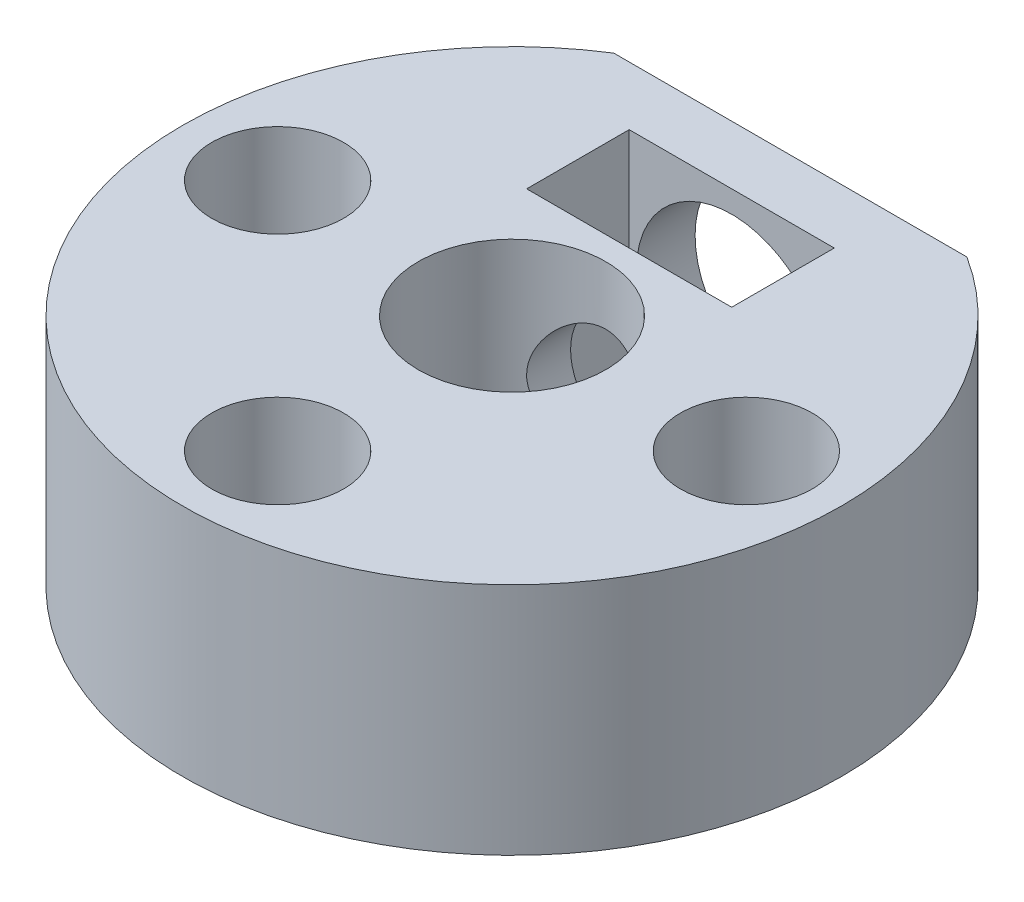
ISO-10303-21;
HEADER;
FILE_DESCRIPTION(('STEP AP214'),'2;1');
FILE_NAME('part.step','',(''),(''),'','','');
FILE_SCHEMA(('AUTOMOTIVE_DESIGN { 1 0 10303 214 1 1 1 1 }'));
ENDSEC;
DATA;
#1=APPLICATION_CONTEXT('core data for automotive mechanical design processes');
#2=APPLICATION_PROTOCOL_DEFINITION('international standard','automotive_design',2000,#1);
#3=PRODUCT_CONTEXT('',#1,'mechanical');
#4=PRODUCT('Part','Part','',(#3));
#5=PRODUCT_RELATED_PRODUCT_CATEGORY('part','',(#4));
#6=PRODUCT_DEFINITION_FORMATION('','',#4);
#7=PRODUCT_DEFINITION_CONTEXT('part definition',#1,'design');
#8=PRODUCT_DEFINITION('design','',#6,#7);
#9=PRODUCT_DEFINITION_SHAPE('','',#8);
#10=(LENGTH_UNIT() NAMED_UNIT(*) SI_UNIT(.MILLI.,.METRE.));
#11=(NAMED_UNIT(*) PLANE_ANGLE_UNIT() SI_UNIT($,.RADIAN.));
#12=(NAMED_UNIT(*) SI_UNIT($,.STERADIAN.) SOLID_ANGLE_UNIT());
#13=UNCERTAINTY_MEASURE_WITH_UNIT(LENGTH_MEASURE(1.E-05),#10,'distance_accuracy_value','');
#14=(GEOMETRIC_REPRESENTATION_CONTEXT(3) GLOBAL_UNCERTAINTY_ASSIGNED_CONTEXT((#13)) GLOBAL_UNIT_ASSIGNED_CONTEXT((#10,
#11,#12)) REPRESENTATION_CONTEXT('',''));
#15=CARTESIAN_POINT('',(0.,0.,0.));
#16=DIRECTION('',(0.,0.,1.));
#17=DIRECTION('',(1.,0.,0.));
#18=AXIS2_PLACEMENT_3D('',#15,#16,#17);
#19=CARTESIAN_POINT('',(0.,8.,0.));
#20=DIRECTION('',(0.,-1.,0.));
#21=DIRECTION('',(0.,0.,-1.));
#22=AXIS2_PLACEMENT_3D('',#19,#20,#21);
#23=CYLINDRICAL_SURFACE('',#22,11.25);
#24=CARTESIAN_POINT('',(0.,0.,0.));
#25=DIRECTION('',(0.,1.,0.));
#26=DIRECTION('',(0.,0.,1.));
#27=AXIS2_PLACEMENT_3D('',#24,#25,#26);
#28=CIRCLE('',#27,11.25);
#29=CARTESIAN_POINT('',(-6.02598539659698,0.,-9.5));
#30=VERTEX_POINT('',#29);
#31=CARTESIAN_POINT('',(6.02598539659698,0.,-9.5));
#32=VERTEX_POINT('',#31);
#33=EDGE_CURVE('E154',#30,#32,#28,.T.);
#34=ORIENTED_EDGE('',*,*,#33,.T.);
#35=DIRECTION('',(0.,-1.,0.));
#36=VECTOR('',#35,1.);
#37=CARTESIAN_POINT('',(6.02598539659698,8.,-9.5));
#38=LINE('',#37,#36);
#39=CARTESIAN_POINT('',(6.02598539659698,8.,-9.5));
#40=VERTEX_POINT('',#39);
#41=EDGE_CURVE('E11',#40,#32,#38,.T.);
#42=ORIENTED_EDGE('',*,*,#41,.F.);
#43=CARTESIAN_POINT('',(0.,8.,0.));
#44=DIRECTION('',(0.,1.,0.));
#45=DIRECTION('',(0.,0.,1.));
#46=AXIS2_PLACEMENT_3D('',#43,#44,#45);
#47=CIRCLE('',#46,11.25);
#48=CARTESIAN_POINT('',(-6.02598539659698,8.,-9.5));
#49=VERTEX_POINT('',#48);
#50=EDGE_CURVE('E158',#49,#40,#47,.T.);
#51=ORIENTED_EDGE('',*,*,#50,.F.);
#52=DIRECTION('',(0.,-1.,0.));
#53=VECTOR('',#52,1.);
#54=CARTESIAN_POINT('',(-6.02598539659698,8.,-9.5));
#55=LINE('',#54,#53);
#56=EDGE_CURVE('E53',#49,#30,#55,.T.);
#57=ORIENTED_EDGE('',*,*,#56,.T.);
#58=EDGE_LOOP('',(#34,#42,#51,#57));
#59=FACE_BOUND('',#58,.T.);
#60=ADVANCED_FACE('F39',(#59),#23,.T.);
#61=CARTESIAN_POINT('',(6.02598539659698,8.,-9.5));
#62=DIRECTION('',(0.,0.,1.));
#63=DIRECTION('',(1.,0.,0.));
#64=AXIS2_PLACEMENT_3D('',#61,#62,#63);
#65=PLANE('',#64);
#66=CARTESIAN_POINT('',(0.,4.,-9.5));
#67=DIRECTION('',(0.,0.,-1.));
#68=DIRECTION('',(-1.,0.,0.));
#69=AXIS2_PLACEMENT_3D('',#66,#67,#68);
#70=CIRCLE('',#69,3.25);
#71=CARTESIAN_POINT('',(-3.25,4.,-9.5));
#72=VERTEX_POINT('',#71);
#73=EDGE_CURVE('E434',#72,#72,#70,.T.);
#74=ORIENTED_EDGE('',*,*,#73,.F.);
#75=EDGE_LOOP('',(#74));
#76=FACE_BOUND('',#75,.T.);
#77=DIRECTION('',(-1.,0.,0.));
#78=VECTOR('',#77,1.);
#79=CARTESIAN_POINT('',(6.02598539659698,0.,-9.5));
#80=LINE('',#79,#78);
#81=EDGE_CURVE('E163',#32,#30,#80,.T.);
#82=ORIENTED_EDGE('',*,*,#81,.T.);
#83=ORIENTED_EDGE('',*,*,#56,.F.);
#84=DIRECTION('',(-1.,0.,0.));
#85=VECTOR('',#84,1.);
#86=CARTESIAN_POINT('',(6.02598539659698,8.,-9.5));
#87=LINE('',#86,#85);
#88=EDGE_CURVE('E162',#40,#49,#87,.T.);
#89=ORIENTED_EDGE('',*,*,#88,.F.);
#90=ORIENTED_EDGE('',*,*,#41,.T.);
#91=EDGE_LOOP('',(#82,#83,#89,#90));
#92=FACE_BOUND('',#91,.T.);
#93=ADVANCED_FACE('F180',(#76,#92),#65,.F.);
#94=CARTESIAN_POINT('',(0.,8.,0.));
#95=DIRECTION('',(0.,1.,0.));
#96=DIRECTION('',(0.,0.,1.));
#97=AXIS2_PLACEMENT_3D('',#94,#95,#96);
#98=PLANE('',#97);
#99=CARTESIAN_POINT('',(-8.,8.,0.));
#100=DIRECTION('',(0.,1.,0.));
#101=DIRECTION('',(0.,0.,1.));
#102=AXIS2_PLACEMENT_3D('',#99,#100,#101);
#103=CIRCLE('',#102,2.25);
#104=CARTESIAN_POINT('',(-8.,8.,2.25));
#105=VERTEX_POINT('',#104);
#106=EDGE_CURVE('E426',#105,#105,#103,.T.);
#107=ORIENTED_EDGE('',*,*,#106,.F.);
#108=EDGE_LOOP('',(#107));
#109=FACE_BOUND('',#108,.T.);
#110=CARTESIAN_POINT('',(0.,8.,8.));
#111=DIRECTION('',(0.,1.,0.));
#112=DIRECTION('',(0.,0.,1.));
#113=AXIS2_PLACEMENT_3D('',#110,#111,#112);
#114=CIRCLE('',#113,2.25);
#115=CARTESIAN_POINT('',(0.,8.,10.25));
#116=VERTEX_POINT('',#115);
#117=EDGE_CURVE('E410',#116,#116,#114,.T.);
#118=ORIENTED_EDGE('',*,*,#117,.F.);
#119=EDGE_LOOP('',(#118));
#120=FACE_BOUND('',#119,.T.);
#121=CARTESIAN_POINT('',(8.,8.,0.));
#122=DIRECTION('',(0.,1.,0.));
#123=DIRECTION('',(0.,0.,1.));
#124=AXIS2_PLACEMENT_3D('',#121,#122,#123);
#125=CIRCLE('',#124,2.25);
#126=CARTESIAN_POINT('',(8.,8.,2.25));
#127=VERTEX_POINT('',#126);
#128=EDGE_CURVE('E392',#127,#127,#125,.T.);
#129=ORIENTED_EDGE('',*,*,#128,.F.);
#130=EDGE_LOOP('',(#129));
#131=FACE_BOUND('',#130,.T.);
#132=DIRECTION('',(0.,0.,-1.));
#133=VECTOR('',#132,1.);
#134=CARTESIAN_POINT('',(3.5,8.,-4.));
#135=LINE('',#134,#133);
#136=CARTESIAN_POINT('',(3.5,8.,-4.));
#137=VERTEX_POINT('',#136);
#138=CARTESIAN_POINT('',(3.5,8.,-7.5));
#139=VERTEX_POINT('',#138);
#140=EDGE_CURVE('E60',#137,#139,#135,.T.);
#141=ORIENTED_EDGE('',*,*,#140,.F.);
#142=DIRECTION('',(1.,0.,0.));
#143=VECTOR('',#142,1.);
#144=CARTESIAN_POINT('',(-3.5,8.,-4.));
#145=LINE('',#144,#143);
#146=CARTESIAN_POINT('',(-3.5,8.,-4.));
#147=VERTEX_POINT('',#146);
#148=EDGE_CURVE('E119',#147,#137,#145,.T.);
#149=ORIENTED_EDGE('',*,*,#148,.F.);
#150=DIRECTION('',(0.,0.,1.));
#151=VECTOR('',#150,1.);
#152=CARTESIAN_POINT('',(-3.5,8.,-4.));
#153=LINE('',#152,#151);
#154=CARTESIAN_POINT('',(-3.5,8.,-7.5));
#155=VERTEX_POINT('',#154);
#156=EDGE_CURVE('E123',#155,#147,#153,.T.);
#157=ORIENTED_EDGE('',*,*,#156,.F.);
#158=DIRECTION('',(-1.,0.,0.));
#159=VECTOR('',#158,1.);
#160=CARTESIAN_POINT('',(-3.5,8.,-7.5));
#161=LINE('',#160,#159);
#162=EDGE_CURVE('E135',#139,#155,#161,.T.);
#163=ORIENTED_EDGE('',*,*,#162,.F.);
#164=EDGE_LOOP('',(#141,#149,#157,#163));
#165=FACE_BOUND('',#164,.T.);
#166=CARTESIAN_POINT('',(0.,8.,0.));
#167=DIRECTION('',(0.,1.,0.));
#168=DIRECTION('',(0.,0.,1.));
#169=AXIS2_PLACEMENT_3D('',#166,#167,#168);
#170=CIRCLE('',#169,3.2);
#171=CARTESIAN_POINT('',(0.,8.,3.2));
#172=VERTEX_POINT('',#171);
#173=EDGE_CURVE('E144',#172,#172,#170,.T.);
#174=ORIENTED_EDGE('',*,*,#173,.F.);
#175=EDGE_LOOP('',(#174));
#176=FACE_BOUND('',#175,.T.);
#177=ORIENTED_EDGE('',*,*,#50,.T.);
#178=ORIENTED_EDGE('',*,*,#88,.T.);
#179=EDGE_LOOP('',(#177,#178));
#180=FACE_BOUND('',#179,.T.);
#181=ADVANCED_FACE('F182',(#109,#120,#131,#165,#176,#180),#98,.T.);
#182=CARTESIAN_POINT('',(0.,0.,0.));
#183=DIRECTION('',(0.,1.,0.));
#184=DIRECTION('',(0.,0.,1.));
#185=AXIS2_PLACEMENT_3D('',#182,#183,#184);
#186=PLANE('',#185);
#187=CARTESIAN_POINT('',(-8.,0.,0.));
#188=DIRECTION('',(0.,1.,0.));
#189=DIRECTION('',(0.,0.,1.));
#190=AXIS2_PLACEMENT_3D('',#187,#188,#189);
#191=CIRCLE('',#190,1.25);
#192=CARTESIAN_POINT('',(-8.,0.,1.25));
#193=VERTEX_POINT('',#192);
#194=EDGE_CURVE('E414',#193,#193,#191,.T.);
#195=ORIENTED_EDGE('',*,*,#194,.T.);
#196=EDGE_LOOP('',(#195));
#197=FACE_BOUND('',#196,.T.);
#198=CARTESIAN_POINT('',(0.,0.,8.));
#199=DIRECTION('',(0.,1.,0.));
#200=DIRECTION('',(0.,0.,1.));
#201=AXIS2_PLACEMENT_3D('',#198,#199,#200);
#202=CIRCLE('',#201,1.25);
#203=CARTESIAN_POINT('',(0.,0.,9.25));
#204=VERTEX_POINT('',#203);
#205=EDGE_CURVE('E398',#204,#204,#202,.T.);
#206=ORIENTED_EDGE('',*,*,#205,.T.);
#207=EDGE_LOOP('',(#206));
#208=FACE_BOUND('',#207,.T.);
#209=CARTESIAN_POINT('',(8.,0.,0.));
#210=DIRECTION('',(0.,1.,0.));
#211=DIRECTION('',(0.,0.,1.));
#212=AXIS2_PLACEMENT_3D('',#209,#210,#211);
#213=CIRCLE('',#212,1.25);
#214=CARTESIAN_POINT('',(8.,0.,1.25));
#215=VERTEX_POINT('',#214);
#216=EDGE_CURVE('E126',#215,#215,#213,.T.);
#217=ORIENTED_EDGE('',*,*,#216,.T.);
#218=EDGE_LOOP('',(#217));
#219=FACE_BOUND('',#218,.T.);
#220=DIRECTION('',(1.,0.,0.));
#221=VECTOR('',#220,1.);
#222=CARTESIAN_POINT('',(-3.5,0.,-4.));
#223=LINE('',#222,#221);
#224=CARTESIAN_POINT('',(-3.5,0.,-4.));
#225=VERTEX_POINT('',#224);
#226=CARTESIAN_POINT('',(3.5,0.,-4.));
#227=VERTEX_POINT('',#226);
#228=EDGE_CURVE('E107',#225,#227,#223,.T.);
#229=ORIENTED_EDGE('',*,*,#228,.T.);
#230=DIRECTION('',(0.,0.,-1.));
#231=VECTOR('',#230,1.);
#232=CARTESIAN_POINT('',(3.5,0.,-4.));
#233=LINE('',#232,#231);
#234=CARTESIAN_POINT('',(3.5,0.,-7.5));
#235=VERTEX_POINT('',#234);
#236=EDGE_CURVE('E100',#227,#235,#233,.T.);
#237=ORIENTED_EDGE('',*,*,#236,.T.);
#238=DIRECTION('',(-1.,0.,0.));
#239=VECTOR('',#238,1.);
#240=CARTESIAN_POINT('',(-3.5,0.,-7.5));
#241=LINE('',#240,#239);
#242=CARTESIAN_POINT('',(-3.5,0.,-7.5));
#243=VERTEX_POINT('',#242);
#244=EDGE_CURVE('E110',#235,#243,#241,.T.);
#245=ORIENTED_EDGE('',*,*,#244,.T.);
#246=DIRECTION('',(0.,0.,1.));
#247=VECTOR('',#246,1.);
#248=CARTESIAN_POINT('',(-3.5,0.,-4.));
#249=LINE('',#248,#247);
#250=EDGE_CURVE('E68',#243,#225,#249,.T.);
#251=ORIENTED_EDGE('',*,*,#250,.T.);
#252=EDGE_LOOP('',(#229,#237,#245,#251));
#253=FACE_BOUND('',#252,.T.);
#254=CARTESIAN_POINT('',(0.,0.,0.));
#255=DIRECTION('',(0.,1.,0.));
#256=DIRECTION('',(0.,0.,1.));
#257=AXIS2_PLACEMENT_3D('',#254,#255,#256);
#258=CIRCLE('',#257,3.2);
#259=CARTESIAN_POINT('',(0.,0.,3.2));
#260=VERTEX_POINT('',#259);
#261=EDGE_CURVE('E150',#260,#260,#258,.T.);
#262=ORIENTED_EDGE('',*,*,#261,.T.);
#263=EDGE_LOOP('',(#262));
#264=FACE_BOUND('',#263,.T.);
#265=ORIENTED_EDGE('',*,*,#33,.F.);
#266=ORIENTED_EDGE('',*,*,#81,.F.);
#267=EDGE_LOOP('',(#265,#266));
#268=FACE_BOUND('',#267,.T.);
#269=ADVANCED_FACE('F115',(#197,#208,#219,#253,#264,#268),#186,.F.);
#270=CARTESIAN_POINT('',(0.,0.,0.));
#271=DIRECTION('',(0.,1.,0.));
#272=DIRECTION('',(0.,0.,1.));
#273=AXIS2_PLACEMENT_3D('',#270,#271,#272);
#274=CYLINDRICAL_SURFACE('',#273,3.2);
#275=CARTESIAN_POINT('',(-2.,4.,-2.49799919935936));
#276=CARTESIAN_POINT('',(-1.99999139536776,4.0993924508847,-2.49801280116094));
#277=CARTESIAN_POINT('',(-1.99252310159465,4.19894053659242,-2.50404228334139));
#278=CARTESIAN_POINT('',(-1.96318321332694,4.39468211212703,-2.52709947528765));
#279=CARTESIAN_POINT('',(-1.9412724868888,4.49086573818442,-2.54415706342585));
#280=CARTESIAN_POINT('',(-1.88460918258991,4.67645171631819,-2.58640136526467));
#281=CARTESIAN_POINT('',(-1.84996789332453,4.76590497389095,-2.61151739868855));
#282=CARTESIAN_POINT('',(-1.76915112899075,4.93761417862111,-2.66692721143094));
#283=CARTESIAN_POINT('',(-1.72297533929742,5.01986992937047,-2.69722113197884));
#284=CARTESIAN_POINT('',(-1.61318300685378,5.18698424716324,-2.76447378199541));
#285=CARTESIAN_POINT('',(-1.54805774990795,5.27071158533221,-2.80178141163757));
#286=CARTESIAN_POINT('',(-1.40529386319494,5.42701231863201,-2.87604513367806));
#287=CARTESIAN_POINT('',(-1.32764445007579,5.49957599565434,-2.9130008938133));
#288=CARTESIAN_POINT('',(-1.1506986644135,5.64016573623705,-2.98767126225618));
#289=CARTESIAN_POINT('',(-1.0499209102568,5.70658826896694,-3.02493955586323));
#290=CARTESIAN_POINT('',(-0.83584651333961,5.8210003276211,-3.09093170718627));
#291=CARTESIAN_POINT('',(-0.722562410365086,5.86900810520204,-3.11966401887744));
#292=CARTESIAN_POINT('',(-0.498843005379135,5.93997169697132,-3.16271746109121));
#293=CARTESIAN_POINT('',(-0.389289017675501,5.96497826623512,-3.17820675875259));
#294=CARTESIAN_POINT('',(-0.166568161059515,5.99621131142944,-3.19760871006727));
#295=CARTESIAN_POINT('',(-0.053405216902305,6.00245752979286,-3.20153353349864));
#296=CARTESIAN_POINT('',(0.156905325474191,5.99623089715583,-3.19764654572032));
#297=CARTESIAN_POINT('',(0.254164037238001,5.9861577979186,-3.19133919699003));
#298=CARTESIAN_POINT('',(0.445290633446093,5.9522128250186,-3.17032435617998));
#299=CARTESIAN_POINT('',(0.539158261035763,5.92833990841972,-3.15561622920332));
#300=CARTESIAN_POINT('',(0.721422587322863,5.86783395984481,-3.11901013783332));
#301=CARTESIAN_POINT('',(0.809804600787275,5.83116828152308,-3.09709378677712));
#302=CARTESIAN_POINT('',(0.979230752753055,5.74644999158311,-3.04777012623473));
#303=CARTESIAN_POINT('',(1.06027321370343,5.69839478577177,-3.02036156600799));
#304=CARTESIAN_POINT('',(1.22354162489906,5.58555493547658,-2.95829159598974));
#305=CARTESIAN_POINT('',(1.30465975183771,5.5194325972265,-2.92315206882378));
#306=CARTESIAN_POINT('',(1.45535775348159,5.37578819162823,-2.8511274041264));
#307=CARTESIAN_POINT('',(1.52492054218617,5.29824955763181,-2.81423978352652));
#308=CARTESIAN_POINT('',(1.65976713414942,5.12207100340926,-2.73714307341023));
#309=CARTESIAN_POINT('',(1.723305847132,5.02199779087628,-2.69712930300852));
#310=CARTESIAN_POINT('',(1.83241845071325,4.81016620859902,-2.62422622402613));
#311=CARTESIAN_POINT('',(1.87802543352875,4.6984298497299,-2.59132384272274));
#312=CARTESIAN_POINT('',(1.9394970697411,4.49636895534171,-2.54547002532879));
#313=CARTESIAN_POINT('',(1.96002946757177,4.40814245976956,-2.5295472689526));
#314=CARTESIAN_POINT('',(1.9889626965762,4.22861569801166,-2.50686622194407));
#315=CARTESIAN_POINT('',(1.99738010164592,4.13731980633876,-2.50009541178056));
#316=CARTESIAN_POINT('',(2.00157657527863,3.95403411113277,-2.49673813650096));
#317=CARTESIAN_POINT('',(1.99732668122696,3.86204319781387,-2.50017501025188));
#318=CARTESIAN_POINT('',(1.97641173689404,3.68035107035008,-2.51673668579837));
#319=CARTESIAN_POINT('',(1.95973640512371,3.59065181605943,-2.52986951047321));
#320=CARTESIAN_POINT('',(1.91527897159771,3.41725058581444,-2.56368096963262));
#321=CARTESIAN_POINT('',(1.8876844900287,3.33347412266945,-2.58423164699511));
#322=CARTESIAN_POINT('',(1.8224392310162,3.1715402647088,-2.63064917505314));
#323=CARTESIAN_POINT('',(1.78478488434266,3.09338487676075,-2.65651791183846));
#324=CARTESIAN_POINT('',(1.6922460283571,2.92911033731665,-2.71659526382314));
#325=CARTESIAN_POINT('',(1.63544598102749,2.844307934001,-2.7514540118127));
#326=CARTESIAN_POINT('',(1.5099044211597,2.68450391609729,-2.82230332801138));
#327=CARTESIAN_POINT('',(1.44115051919448,2.60951261283519,-2.85829503845369));
#328=CARTESIAN_POINT('',(1.28060905519863,2.45922680601088,-2.93413062430361));
#329=CARTESIAN_POINT('',(1.18689591954257,2.38581030878765,-2.97366727660159));
#330=CARTESIAN_POINT('',(0.98607998059122,2.25589015699858,-3.04614798344002));
#331=CARTESIAN_POINT('',(0.878983485997752,2.19937857604212,-3.07909512526615));
#332=CARTESIAN_POINT('',(0.660681441018447,2.10880801407574,-3.132948095321));
#333=CARTESIAN_POINT('',(0.550103716071118,2.07360926964675,-3.1544557534269));
#334=CARTESIAN_POINT('',(0.322977598215484,2.02283733011025,-3.18571216140865));
#335=CARTESIAN_POINT('',(0.206437701181278,2.00723697638221,-3.19547718292806));
#336=CARTESIAN_POINT('',(-0.0105585151950031,1.99752556793795,-3.20154697197694));
#337=CARTESIAN_POINT('',(-0.11085007615286,2.00058275714083,-3.19962560997786));
#338=CARTESIAN_POINT('',(-0.309247697746856,2.02153867995895,-3.18657183934034));
#339=CARTESIAN_POINT('',(-0.407353857345281,2.03943674012125,-3.17543984866428));
#340=CARTESIAN_POINT('',(-0.595269271496931,2.08825675980258,-3.14553767502366));
#341=CARTESIAN_POINT('',(-0.685248289085382,2.11870534379716,-3.1270458795472));
#342=CARTESIAN_POINT('',(-0.858742990578188,2.19129588506255,-3.08391949883621));
#343=CARTESIAN_POINT('',(-0.942257580989266,2.23343981516099,-3.05928387730246));
#344=CARTESIAN_POINT('',(-1.10985077995315,2.33305692638598,-3.00280547583716));
#345=CARTESIAN_POINT('',(-1.19308820345962,2.39166717011043,-2.97048003947126));
#346=CARTESIAN_POINT('',(-1.34914657336874,2.52012260853239,-2.90293824729977));
#347=CARTESIAN_POINT('',(-1.42195558888844,2.58998048039358,-2.86771865168989));
#348=CARTESIAN_POINT('',(-1.56595776208135,2.75058601968532,-2.79200664159236));
#349=CARTESIAN_POINT('',(-1.63540527798112,2.84289335228316,-2.75148594314098));
#350=CARTESIAN_POINT('',(-1.75803720009196,3.03943146561629,-2.67479714395255));
#351=CARTESIAN_POINT('',(-1.81123060091364,3.14365560785226,-2.63862664267279));
#352=CARTESIAN_POINT('',(-1.88958577477173,3.33824442868758,-2.58287641728339));
#353=CARTESIAN_POINT('',(-1.91833946042213,3.4266170894071,-2.56139744559441));
#354=CARTESIAN_POINT('',(-1.96340515488654,3.60795084473162,-2.52702653500701));
#355=CARTESIAN_POINT('',(-1.97975654792649,3.70089640803874,-2.5141074304028));
#356=CARTESIAN_POINT('',(-1.99295849892956,3.82884883818066,-2.5036233022303));
#357=CARTESIAN_POINT('',(-1.99559474015329,3.86298263282726,-2.50152111274923));
#358=CARTESIAN_POINT('',(-1.99911719574861,3.93140474643442,-2.49870653912075));
#359=CARTESIAN_POINT('',(-2.00000297002677,3.96569310208271,-2.49799450447948));
#360=CARTESIAN_POINT('',(-2.,4.,-2.49799919935936));
#361=B_SPLINE_CURVE_WITH_KNOTS('',3,(#275,#276,#277,#278,#279,#280,#281,#282,#283,#284,#285,
#286,#287,#288,#289,#290,#291,#292,#293,#294,#295,#296,#297,#298,#299,#300,#301,#302,#303,#304,
#305,#306,#307,#308,#309,#310,#311,#312,#313,#314,#315,#316,#317,#318,#319,#320,#321,#322,#323,
#324,#325,#326,#327,#328,#329,#330,#331,#332,#333,#334,#335,#336,#337,#338,#339,#340,#341,#342,
#343,#344,#345,#346,#347,#348,#349,#350,#351,#352,#353,#354,#355,#356,#357,#358,#359,#360),
.UNSPECIFIED.,.T.,.F.,(4,2,2,2,2,2,2,2,2,2,2,2,2,2,2,2,2,2,2,2,2,2,2,2,2,2,2,2,2,2,2,2,2,2,2,2,
2,2,2,2,2,2,4),(0.,0.298019910419245,0.596850647035398,0.893128889808708,1.18941521500449,
1.52544993190421,1.86177553596668,2.23867577655141,2.61520148382827,2.95344660504646,
3.29133564947828,3.58387711333626,3.8764406892227,4.16975639721538,4.46313897805082,
4.7930320773138,5.12340870425906,5.49692908673939,5.86975688155524,6.14452440771507,
6.41891568014741,6.6939348038826,6.96918174659207,7.23989139752835,7.51069722382494,
7.83306133779285,8.15576157579486,8.53018557860503,8.90443374501682,9.25632128794358,
9.60772066017417,9.90725762443276,10.2067809969681,10.4959131058616,10.7850940166369,
11.1042903057707,11.4238489113727,11.7894690787708,12.154886553397,12.4399504363574,
12.724105247445,12.8269457451427,12.929812095183),.UNSPECIFIED.);
#362=CARTESIAN_POINT('',(-2.,4.,-2.49799919935936));
#363=VERTEX_POINT('',#362);
#364=EDGE_CURVE('E42',#363,#363,#361,.T.);
#365=ORIENTED_EDGE('',*,*,#364,.T.);
#366=EDGE_LOOP('',(#365));
#367=FACE_BOUND('',#366,.T.);
#368=ORIENTED_EDGE('',*,*,#261,.F.);
#369=EDGE_LOOP('',(#368));
#370=FACE_BOUND('',#369,.T.);
#371=ORIENTED_EDGE('',*,*,#173,.T.);
#372=EDGE_LOOP('',(#371));
#373=FACE_BOUND('',#372,.T.);
#374=ADVANCED_FACE('F190',(#367,#370,#373),#274,.F.);
#375=CARTESIAN_POINT('',(3.5,0.,-4.));
#376=DIRECTION('',(1.,0.,0.));
#377=DIRECTION('',(0.,0.,-1.));
#378=AXIS2_PLACEMENT_3D('',#375,#376,#377);
#379=PLANE('',#378);
#380=ORIENTED_EDGE('',*,*,#140,.T.);
#381=DIRECTION('',(0.,1.,0.));
#382=VECTOR('',#381,1.);
#383=CARTESIAN_POINT('',(3.5,0.,-7.5));
#384=LINE('',#383,#382);
#385=EDGE_CURVE('E96',#235,#139,#384,.T.);
#386=ORIENTED_EDGE('',*,*,#385,.F.);
#387=ORIENTED_EDGE('',*,*,#236,.F.);
#388=DIRECTION('',(0.,1.,0.));
#389=VECTOR('',#388,1.);
#390=CARTESIAN_POINT('',(3.5,0.,-4.));
#391=LINE('',#390,#389);
#392=EDGE_CURVE('E141',#227,#137,#391,.T.);
#393=ORIENTED_EDGE('',*,*,#392,.T.);
#394=EDGE_LOOP('',(#380,#386,#387,#393));
#395=FACE_BOUND('',#394,.T.);
#396=ADVANCED_FACE('F98',(#395),#379,.F.);
#397=CARTESIAN_POINT('',(-3.5,0.,-4.));
#398=DIRECTION('',(0.,0.,1.));
#399=DIRECTION('',(1.,0.,0.));
#400=AXIS2_PLACEMENT_3D('',#397,#398,#399);
#401=PLANE('',#400);
#402=CARTESIAN_POINT('',(0.,4.,-4.));
#403=DIRECTION('',(0.,0.,1.));
#404=DIRECTION('',(1.,0.,0.));
#405=AXIS2_PLACEMENT_3D('',#402,#403,#404);
#406=CIRCLE('',#405,2.);
#407=CARTESIAN_POINT('',(2.,4.,-4.));
#408=VERTEX_POINT('',#407);
#409=EDGE_CURVE('E430',#408,#408,#406,.T.);
#410=ORIENTED_EDGE('',*,*,#409,.T.);
#411=EDGE_LOOP('',(#410));
#412=FACE_BOUND('',#411,.T.);
#413=ORIENTED_EDGE('',*,*,#148,.T.);
#414=ORIENTED_EDGE('',*,*,#392,.F.);
#415=ORIENTED_EDGE('',*,*,#228,.F.);
#416=DIRECTION('',(0.,1.,0.));
#417=VECTOR('',#416,1.);
#418=CARTESIAN_POINT('',(-3.5,0.,-4.));
#419=LINE('',#418,#417);
#420=EDGE_CURVE('E145',#225,#147,#419,.T.);
#421=ORIENTED_EDGE('',*,*,#420,.T.);
#422=EDGE_LOOP('',(#413,#414,#415,#421));
#423=FACE_BOUND('',#422,.T.);
#424=ADVANCED_FACE('F227',(#412,#423),#401,.F.);
#425=CARTESIAN_POINT('',(-3.5,0.,-4.));
#426=DIRECTION('',(-1.,0.,0.));
#427=DIRECTION('',(0.,0.,1.));
#428=AXIS2_PLACEMENT_3D('',#425,#426,#427);
#429=PLANE('',#428);
#430=ORIENTED_EDGE('',*,*,#156,.T.);
#431=ORIENTED_EDGE('',*,*,#420,.F.);
#432=ORIENTED_EDGE('',*,*,#250,.F.);
#433=DIRECTION('',(0.,1.,0.));
#434=VECTOR('',#433,1.);
#435=CARTESIAN_POINT('',(-3.5,0.,-7.5));
#436=LINE('',#435,#434);
#437=EDGE_CURVE('E106',#243,#155,#436,.T.);
#438=ORIENTED_EDGE('',*,*,#437,.T.);
#439=EDGE_LOOP('',(#430,#431,#432,#438));
#440=FACE_BOUND('',#439,.T.);
#441=ADVANCED_FACE('F232',(#440),#429,.F.);
#442=CARTESIAN_POINT('',(-3.5,0.,-7.5));
#443=DIRECTION('',(0.,0.,-1.));
#444=DIRECTION('',(-1.,0.,0.));
#445=AXIS2_PLACEMENT_3D('',#442,#443,#444);
#446=PLANE('',#445);
#447=CARTESIAN_POINT('',(0.,4.,-7.5));
#448=DIRECTION('',(0.,0.,-1.));
#449=DIRECTION('',(-1.,0.,0.));
#450=AXIS2_PLACEMENT_3D('',#447,#448,#449);
#451=CIRCLE('',#450,3.25);
#452=CARTESIAN_POINT('',(-3.25,4.,-7.5));
#453=VERTEX_POINT('',#452);
#454=EDGE_CURVE('E438',#453,#453,#451,.T.);
#455=ORIENTED_EDGE('',*,*,#454,.T.);
#456=EDGE_LOOP('',(#455));
#457=FACE_BOUND('',#456,.T.);
#458=ORIENTED_EDGE('',*,*,#162,.T.);
#459=ORIENTED_EDGE('',*,*,#437,.F.);
#460=ORIENTED_EDGE('',*,*,#244,.F.);
#461=ORIENTED_EDGE('',*,*,#385,.T.);
#462=EDGE_LOOP('',(#458,#459,#460,#461));
#463=FACE_BOUND('',#462,.T.);
#464=ADVANCED_FACE('F111',(#457,#463),#446,.F.);
#465=CARTESIAN_POINT('',(8.,8.,0.));
#466=DIRECTION('',(0.,1.,0.));
#467=DIRECTION('',(0.,0.,1.));
#468=AXIS2_PLACEMENT_3D('',#465,#466,#467);
#469=CYLINDRICAL_SURFACE('',#468,1.25);
#470=ORIENTED_EDGE('',*,*,#216,.F.);
#471=EDGE_LOOP('',(#470));
#472=FACE_BOUND('',#471,.T.);
#473=CARTESIAN_POINT('',(8.,2.7,0.));
#474=DIRECTION('',(0.,1.,0.));
#475=DIRECTION('',(0.,0.,1.));
#476=AXIS2_PLACEMENT_3D('',#473,#474,#475);
#477=CIRCLE('',#476,1.25);
#478=CARTESIAN_POINT('',(8.,2.7,1.25));
#479=VERTEX_POINT('',#478);
#480=EDGE_CURVE('E386',#479,#479,#477,.T.);
#481=ORIENTED_EDGE('',*,*,#480,.T.);
#482=EDGE_LOOP('',(#481));
#483=FACE_BOUND('',#482,.T.);
#484=ADVANCED_FACE('F244',(#472,#483),#469,.F.);
#485=CARTESIAN_POINT('',(9.25,2.7,0.));
#486=DIRECTION('',(0.,-1.,0.));
#487=DIRECTION('',(0.,0.,-1.));
#488=AXIS2_PLACEMENT_3D('',#485,#486,#487);
#489=PLANE('',#488);
#490=ORIENTED_EDGE('',*,*,#480,.F.);
#491=EDGE_LOOP('',(#490));
#492=FACE_BOUND('',#491,.T.);
#493=CARTESIAN_POINT('',(8.,2.7,0.));
#494=DIRECTION('',(0.,1.,0.));
#495=DIRECTION('',(0.,0.,1.));
#496=AXIS2_PLACEMENT_3D('',#493,#494,#495);
#497=CIRCLE('',#496,2.25);
#498=CARTESIAN_POINT('',(8.,2.7,2.25));
#499=VERTEX_POINT('',#498);
#500=EDGE_CURVE('E388',#499,#499,#497,.T.);
#501=ORIENTED_EDGE('',*,*,#500,.T.);
#502=EDGE_LOOP('',(#501));
#503=FACE_BOUND('',#502,.T.);
#504=ADVANCED_FACE('F299',(#492,#503),#489,.F.);
#505=CARTESIAN_POINT('',(8.,8.,0.));
#506=DIRECTION('',(0.,1.,0.));
#507=DIRECTION('',(0.,0.,1.));
#508=AXIS2_PLACEMENT_3D('',#505,#506,#507);
#509=CYLINDRICAL_SURFACE('',#508,2.25);
#510=ORIENTED_EDGE('',*,*,#500,.F.);
#511=EDGE_LOOP('',(#510));
#512=FACE_BOUND('',#511,.T.);
#513=ORIENTED_EDGE('',*,*,#128,.T.);
#514=EDGE_LOOP('',(#513));
#515=FACE_BOUND('',#514,.T.);
#516=ADVANCED_FACE('F295',(#512,#515),#509,.F.);
#517=CARTESIAN_POINT('',(0.,8.,8.));
#518=DIRECTION('',(0.,1.,0.));
#519=DIRECTION('',(0.,0.,1.));
#520=AXIS2_PLACEMENT_3D('',#517,#518,#519);
#521=CYLINDRICAL_SURFACE('',#520,1.25);
#522=ORIENTED_EDGE('',*,*,#205,.F.);
#523=EDGE_LOOP('',(#522));
#524=FACE_BOUND('',#523,.T.);
#525=CARTESIAN_POINT('',(0.,2.7,8.));
#526=DIRECTION('',(0.,1.,0.));
#527=DIRECTION('',(0.,0.,1.));
#528=AXIS2_PLACEMENT_3D('',#525,#526,#527);
#529=CIRCLE('',#528,1.25);
#530=CARTESIAN_POINT('',(0.,2.7,9.25));
#531=VERTEX_POINT('',#530);
#532=EDGE_CURVE('E402',#531,#531,#529,.T.);
#533=ORIENTED_EDGE('',*,*,#532,.T.);
#534=EDGE_LOOP('',(#533));
#535=FACE_BOUND('',#534,.T.);
#536=ADVANCED_FACE('F291',(#524,#535),#521,.F.);
#537=CARTESIAN_POINT('',(1.25,2.7,8.));
#538=DIRECTION('',(0.,-1.,0.));
#539=DIRECTION('',(0.,0.,-1.));
#540=AXIS2_PLACEMENT_3D('',#537,#538,#539);
#541=PLANE('',#540);
#542=ORIENTED_EDGE('',*,*,#532,.F.);
#543=EDGE_LOOP('',(#542));
#544=FACE_BOUND('',#543,.T.);
#545=CARTESIAN_POINT('',(0.,2.7,8.));
#546=DIRECTION('',(0.,1.,0.));
#547=DIRECTION('',(0.,0.,1.));
#548=AXIS2_PLACEMENT_3D('',#545,#546,#547);
#549=CIRCLE('',#548,2.25);
#550=CARTESIAN_POINT('',(0.,2.7,10.25));
#551=VERTEX_POINT('',#550);
#552=EDGE_CURVE('E406',#551,#551,#549,.T.);
#553=ORIENTED_EDGE('',*,*,#552,.T.);
#554=EDGE_LOOP('',(#553));
#555=FACE_BOUND('',#554,.T.);
#556=ADVANCED_FACE('F287',(#544,#555),#541,.F.);
#557=CARTESIAN_POINT('',(0.,8.,8.));
#558=DIRECTION('',(0.,1.,0.));
#559=DIRECTION('',(0.,0.,1.));
#560=AXIS2_PLACEMENT_3D('',#557,#558,#559);
#561=CYLINDRICAL_SURFACE('',#560,2.25);
#562=ORIENTED_EDGE('',*,*,#552,.F.);
#563=EDGE_LOOP('',(#562));
#564=FACE_BOUND('',#563,.T.);
#565=ORIENTED_EDGE('',*,*,#117,.T.);
#566=EDGE_LOOP('',(#565));
#567=FACE_BOUND('',#566,.T.);
#568=ADVANCED_FACE('F283',(#564,#567),#561,.F.);
#569=CARTESIAN_POINT('',(-8.,8.,0.));
#570=DIRECTION('',(0.,1.,0.));
#571=DIRECTION('',(0.,0.,1.));
#572=AXIS2_PLACEMENT_3D('',#569,#570,#571);
#573=CYLINDRICAL_SURFACE('',#572,1.25);
#574=ORIENTED_EDGE('',*,*,#194,.F.);
#575=EDGE_LOOP('',(#574));
#576=FACE_BOUND('',#575,.T.);
#577=CARTESIAN_POINT('',(-8.,2.7,0.));
#578=DIRECTION('',(0.,1.,0.));
#579=DIRECTION('',(0.,0.,1.));
#580=AXIS2_PLACEMENT_3D('',#577,#578,#579);
#581=CIRCLE('',#580,1.25);
#582=CARTESIAN_POINT('',(-8.,2.7,1.25));
#583=VERTEX_POINT('',#582);
#584=EDGE_CURVE('E418',#583,#583,#581,.T.);
#585=ORIENTED_EDGE('',*,*,#584,.T.);
#586=EDGE_LOOP('',(#585));
#587=FACE_BOUND('',#586,.T.);
#588=ADVANCED_FACE('F279',(#576,#587),#573,.F.);
#589=CARTESIAN_POINT('',(-6.75,2.7,0.));
#590=DIRECTION('',(0.,-1.,0.));
#591=DIRECTION('',(0.,0.,-1.));
#592=AXIS2_PLACEMENT_3D('',#589,#590,#591);
#593=PLANE('',#592);
#594=ORIENTED_EDGE('',*,*,#584,.F.);
#595=EDGE_LOOP('',(#594));
#596=FACE_BOUND('',#595,.T.);
#597=CARTESIAN_POINT('',(-8.,2.7,0.));
#598=DIRECTION('',(0.,1.,0.));
#599=DIRECTION('',(0.,0.,1.));
#600=AXIS2_PLACEMENT_3D('',#597,#598,#599);
#601=CIRCLE('',#600,2.25);
#602=CARTESIAN_POINT('',(-8.,2.7,2.25));
#603=VERTEX_POINT('',#602);
#604=EDGE_CURVE('E422',#603,#603,#601,.T.);
#605=ORIENTED_EDGE('',*,*,#604,.T.);
#606=EDGE_LOOP('',(#605));
#607=FACE_BOUND('',#606,.T.);
#608=ADVANCED_FACE('F275',(#596,#607),#593,.F.);
#609=CARTESIAN_POINT('',(-8.,8.,0.));
#610=DIRECTION('',(0.,1.,0.));
#611=DIRECTION('',(0.,0.,1.));
#612=AXIS2_PLACEMENT_3D('',#609,#610,#611);
#613=CYLINDRICAL_SURFACE('',#612,2.25);
#614=ORIENTED_EDGE('',*,*,#604,.F.);
#615=EDGE_LOOP('',(#614));
#616=FACE_BOUND('',#615,.T.);
#617=ORIENTED_EDGE('',*,*,#106,.T.);
#618=EDGE_LOOP('',(#617));
#619=FACE_BOUND('',#618,.T.);
#620=ADVANCED_FACE('F211',(#616,#619),#613,.F.);
#621=CARTESIAN_POINT('',(0.,4.,-9.5));
#622=DIRECTION('',(0.,0.,-1.));
#623=DIRECTION('',(-1.,0.,0.));
#624=AXIS2_PLACEMENT_3D('',#621,#622,#623);
#625=CYLINDRICAL_SURFACE('',#624,2.);
#626=ORIENTED_EDGE('',*,*,#364,.F.);
#627=EDGE_LOOP('',(#626));
#628=FACE_BOUND('',#627,.T.);
#629=ORIENTED_EDGE('',*,*,#409,.F.);
#630=EDGE_LOOP('',(#629));
#631=FACE_BOUND('',#630,.T.);
#632=ADVANCED_FACE('F252',(#628,#631),#625,.F.);
#633=CARTESIAN_POINT('',(0.,4.,-9.5));
#634=DIRECTION('',(0.,0.,-1.));
#635=DIRECTION('',(-1.,0.,0.));
#636=AXIS2_PLACEMENT_3D('',#633,#634,#635);
#637=CYLINDRICAL_SURFACE('',#636,3.25);
#638=ORIENTED_EDGE('',*,*,#454,.F.);
#639=EDGE_LOOP('',(#638));
#640=FACE_BOUND('',#639,.T.);
#641=ORIENTED_EDGE('',*,*,#73,.T.);
#642=EDGE_LOOP('',(#641));
#643=FACE_BOUND('',#642,.T.);
#644=ADVANCED_FACE('F257',(#640,#643),#637,.F.);
#645=CLOSED_SHELL('',(#60,#93,#181,#269,#374,#396,#424,#441,#464,#484,#504,#516,#536,#556,#568,
#588,#608,#620,#632,#644));
#646=MANIFOLD_SOLID_BREP('B2',#645);
#647=ADVANCED_BREP_SHAPE_REPRESENTATION('',(#18,#646),#14);
#648=SHAPE_DEFINITION_REPRESENTATION(#9,#647);
ENDSEC;
END-ISO-10303-21;
